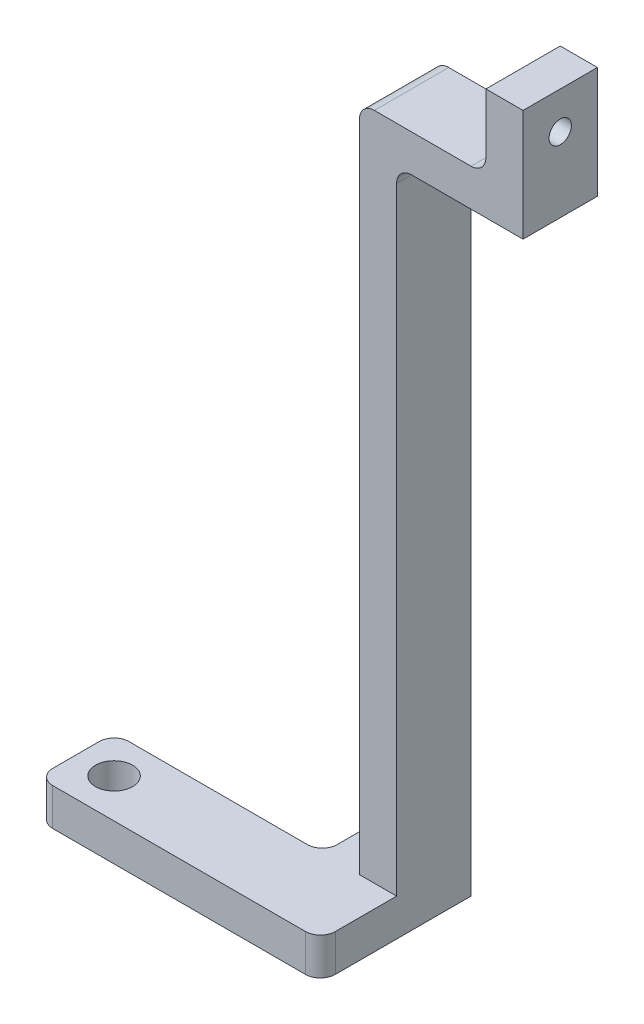
ISO-10303-21;
HEADER;
FILE_DESCRIPTION(('STEP AP214'),'2;1');
FILE_NAME('part.step','',(''),(''),'','','');
FILE_SCHEMA(('AUTOMOTIVE_DESIGN { 1 0 10303 214 1 1 1 1 }'));
ENDSEC;
DATA;
#1=APPLICATION_CONTEXT('core data for automotive mechanical design processes');
#2=APPLICATION_PROTOCOL_DEFINITION('international standard','automotive_design',2000,#1);
#3=PRODUCT_CONTEXT('',#1,'mechanical');
#4=PRODUCT('Part','Part','',(#3));
#5=PRODUCT_RELATED_PRODUCT_CATEGORY('part','',(#4));
#6=PRODUCT_DEFINITION_FORMATION('','',#4);
#7=PRODUCT_DEFINITION_CONTEXT('part definition',#1,'design');
#8=PRODUCT_DEFINITION('design','',#6,#7);
#9=PRODUCT_DEFINITION_SHAPE('','',#8);
#10=(LENGTH_UNIT() NAMED_UNIT(*) SI_UNIT(.MILLI.,.METRE.));
#11=(NAMED_UNIT(*) PLANE_ANGLE_UNIT() SI_UNIT($,.RADIAN.));
#12=(NAMED_UNIT(*) SI_UNIT($,.STERADIAN.) SOLID_ANGLE_UNIT());
#13=UNCERTAINTY_MEASURE_WITH_UNIT(LENGTH_MEASURE(1.E-05),#10,'distance_accuracy_value','');
#14=(GEOMETRIC_REPRESENTATION_CONTEXT(3) GLOBAL_UNCERTAINTY_ASSIGNED_CONTEXT((#13)) GLOBAL_UNIT_ASSIGNED_CONTEXT((#10,
#11,#12)) REPRESENTATION_CONTEXT('',''));
#15=CARTESIAN_POINT('',(0.,0.,0.));
#16=DIRECTION('',(0.,0.,1.));
#17=DIRECTION('',(1.,0.,0.));
#18=AXIS2_PLACEMENT_3D('',#15,#16,#17);
#19=CARTESIAN_POINT('',(0.,102.,0.));
#20=DIRECTION('',(0.,-1.,0.));
#21=DIRECTION('',(0.,0.,-1.));
#22=AXIS2_PLACEMENT_3D('',#19,#20,#21);
#23=PLANE('',#22);
#24=DIRECTION('',(1.,0.,0.));
#25=VECTOR('',#24,1.);
#26=CARTESIAN_POINT('',(17.,102.,-4.99999999999999));
#27=LINE('',#26,#25);
#28=CARTESIAN_POINT('',(-20.,102.,-4.99999999999999));
#29=VERTEX_POINT('',#28);
#30=CARTESIAN_POINT('',(-7.,102.,-4.99999999999999));
#31=VERTEX_POINT('',#30);
#32=EDGE_CURVE('E256',#29,#31,#27,.T.);
#33=ORIENTED_EDGE('',*,*,#32,.T.);
#34=DIRECTION('',(0.,0.,1.));
#35=VECTOR('',#34,1.);
#36=CARTESIAN_POINT('',(-7.,102.,-15.));
#37=LINE('',#36,#35);
#38=CARTESIAN_POINT('',(-7.,102.,-15.));
#39=VERTEX_POINT('',#38);
#40=EDGE_CURVE('E354',#31,#39,#37,.F.);
#41=ORIENTED_EDGE('',*,*,#40,.T.);
#42=DIRECTION('',(-1.,0.,0.));
#43=VECTOR('',#42,1.);
#44=CARTESIAN_POINT('',(17.,102.,-15.));
#45=LINE('',#44,#43);
#46=CARTESIAN_POINT('',(-20.,102.,-15.));
#47=VERTEX_POINT('',#46);
#48=EDGE_CURVE('E263',#39,#47,#45,.T.);
#49=ORIENTED_EDGE('',*,*,#48,.T.);
#50=DIRECTION('',(0.,0.,1.));
#51=VECTOR('',#50,1.);
#52=CARTESIAN_POINT('',(-20.,102.,0.));
#53=LINE('',#52,#51);
#54=EDGE_CURVE('E253',#47,#29,#53,.T.);
#55=ORIENTED_EDGE('',*,*,#54,.T.);
#56=EDGE_LOOP('',(#33,#41,#49,#55));
#57=FACE_BOUND('',#56,.T.);
#58=ADVANCED_FACE('F43',(#57),#23,.F.);
#59=CARTESIAN_POINT('',(-22.,102.,-15.));
#60=DIRECTION('',(1.,0.,0.));
#61=DIRECTION('',(0.,0.,-1.));
#62=AXIS2_PLACEMENT_3D('',#59,#60,#61);
#63=PLANE('',#62);
#64=DIRECTION('',(0.,0.,-1.));
#65=VECTOR('',#64,1.);
#66=CARTESIAN_POINT('',(-22.,12.,-5.));
#67=LINE('',#66,#65);
#68=CARTESIAN_POINT('',(-22.,12.,-5.));
#69=VERTEX_POINT('',#68);
#70=CARTESIAN_POINT('',(-22.,12.,-15.));
#71=VERTEX_POINT('',#70);
#72=EDGE_CURVE('E223',#69,#71,#67,.T.);
#73=ORIENTED_EDGE('',*,*,#72,.F.);
#74=DIRECTION('',(0.,-1.,0.));
#75=VECTOR('',#74,1.);
#76=CARTESIAN_POINT('',(-22.,102.,-5.));
#77=LINE('',#76,#75);
#78=CARTESIAN_POINT('',(-22.,100.,-5.));
#79=VERTEX_POINT('',#78);
#80=EDGE_CURVE('E239',#79,#69,#77,.T.);
#81=ORIENTED_EDGE('',*,*,#80,.F.);
#82=DIRECTION('',(0.,0.,1.));
#83=VECTOR('',#82,1.);
#84=CARTESIAN_POINT('',(-22.,100.,-15.));
#85=LINE('',#84,#83);
#86=CARTESIAN_POINT('',(-22.,100.,-15.));
#87=VERTEX_POINT('',#86);
#88=EDGE_CURVE('E250',#79,#87,#85,.F.);
#89=ORIENTED_EDGE('',*,*,#88,.T.);
#90=DIRECTION('',(0.,-1.,0.));
#91=VECTOR('',#90,1.);
#92=CARTESIAN_POINT('',(-22.,102.,-15.));
#93=LINE('',#92,#91);
#94=EDGE_CURVE('E252',#87,#71,#93,.T.);
#95=ORIENTED_EDGE('',*,*,#94,.T.);
#96=EDGE_LOOP('',(#73,#81,#89,#95));
#97=FACE_BOUND('',#96,.T.);
#98=ADVANCED_FACE('F430',(#97),#63,.F.);
#99=CARTESIAN_POINT('',(-17.,102.,-15.));
#100=DIRECTION('',(-1.,0.,0.));
#101=DIRECTION('',(0.,0.,1.));
#102=AXIS2_PLACEMENT_3D('',#99,#100,#101);
#103=PLANE('',#102);
#104=DIRECTION('',(0.,-1.,0.));
#105=VECTOR('',#104,1.);
#106=CARTESIAN_POINT('',(-17.,102.,-15.));
#107=LINE('',#106,#105);
#108=CARTESIAN_POINT('',(-17.,95.,-15.));
#109=VERTEX_POINT('',#108);
#110=CARTESIAN_POINT('',(-17.,7.00000000000001,-15.));
#111=VERTEX_POINT('',#110);
#112=EDGE_CURVE('E242',#109,#111,#107,.T.);
#113=ORIENTED_EDGE('',*,*,#112,.F.);
#114=DIRECTION('',(0.,0.,-1.));
#115=VECTOR('',#114,1.);
#116=CARTESIAN_POINT('',(-17.,95.,-5.));
#117=LINE('',#116,#115);
#118=CARTESIAN_POINT('',(-17.,95.,-5.));
#119=VERTEX_POINT('',#118);
#120=EDGE_CURVE('E234',#109,#119,#117,.F.);
#121=ORIENTED_EDGE('',*,*,#120,.T.);
#122=DIRECTION('',(0.,-1.,0.));
#123=VECTOR('',#122,1.);
#124=CARTESIAN_POINT('',(-17.,102.,-5.));
#125=LINE('',#124,#123);
#126=CARTESIAN_POINT('',(-17.,12.,-5.));
#127=VERTEX_POINT('',#126);
#128=EDGE_CURVE('E244',#119,#127,#125,.T.);
#129=ORIENTED_EDGE('',*,*,#128,.T.);
#130=DIRECTION('',(0.,0.,-1.));
#131=VECTOR('',#130,1.);
#132=CARTESIAN_POINT('',(-17.,12.,-5.));
#133=LINE('',#132,#131);
#134=CARTESIAN_POINT('',(-17.,12.,3.25062536576994));
#135=VERTEX_POINT('',#134);
#136=EDGE_CURVE('E318',#135,#127,#133,.T.);
#137=ORIENTED_EDGE('',*,*,#136,.F.);
#138=DIRECTION('',(0.,-1.,0.));
#139=VECTOR('',#138,1.);
#140=CARTESIAN_POINT('',(-17.,12.,3.25062536576994));
#141=LINE('',#140,#139);
#142=CARTESIAN_POINT('',(-17.,7.,3.25062536576994));
#143=VERTEX_POINT('',#142);
#144=EDGE_CURVE('E274',#135,#143,#141,.T.);
#145=ORIENTED_EDGE('',*,*,#144,.T.);
#146=DIRECTION('',(0.,0.,-1.));
#147=VECTOR('',#146,1.);
#148=CARTESIAN_POINT('',(-17.,7.,-15.));
#149=LINE('',#148,#147);
#150=EDGE_CURVE('E195',#143,#111,#149,.T.);
#151=ORIENTED_EDGE('',*,*,#150,.T.);
#152=EDGE_LOOP('',(#113,#121,#129,#137,#145,#151));
#153=FACE_BOUND('',#152,.T.);
#154=ADVANCED_FACE('F405',(#153),#103,.F.);
#155=CARTESIAN_POINT('',(17.,102.,-15.));
#156=DIRECTION('',(0.,0.,1.));
#157=DIRECTION('',(1.,0.,0.));
#158=AXIS2_PLACEMENT_3D('',#155,#156,#157);
#159=PLANE('',#158);
#160=DIRECTION('',(-1.,0.,0.));
#161=VECTOR('',#160,1.);
#162=CARTESIAN_POINT('',(-22.,7.,-15.));
#163=LINE('',#162,#161);
#164=CARTESIAN_POINT('',(-25.,7.,-15.));
#165=VERTEX_POINT('',#164);
#166=EDGE_CURVE('E260',#111,#165,#163,.T.);
#167=ORIENTED_EDGE('',*,*,#166,.T.);
#168=DIRECTION('',(0.,-1.,0.));
#169=VECTOR('',#168,1.);
#170=CARTESIAN_POINT('',(-25.,12.,-15.));
#171=LINE('',#170,#169);
#172=CARTESIAN_POINT('',(-25.,12.,-15.));
#173=VERTEX_POINT('',#172);
#174=EDGE_CURVE('E346',#165,#173,#171,.F.);
#175=ORIENTED_EDGE('',*,*,#174,.T.);
#176=DIRECTION('',(1.,0.,0.));
#177=VECTOR('',#176,1.);
#178=CARTESIAN_POINT('',(-27.,12.,-15.));
#179=LINE('',#178,#177);
#180=EDGE_CURVE('E230',#173,#71,#179,.T.);
#181=ORIENTED_EDGE('',*,*,#180,.T.);
#182=ORIENTED_EDGE('',*,*,#94,.F.);
#183=CARTESIAN_POINT('',(-20.,100.,-15.));
#184=DIRECTION('',(0.,0.,1.));
#185=DIRECTION('',(1.,0.,0.));
#186=AXIS2_PLACEMENT_3D('',#183,#184,#185);
#187=CIRCLE('',#186,2.);
#188=EDGE_CURVE('E257',#87,#47,#187,.F.);
#189=ORIENTED_EDGE('',*,*,#188,.T.);
#190=ORIENTED_EDGE('',*,*,#48,.F.);
#191=CARTESIAN_POINT('',(-7.,104.,-15.));
#192=DIRECTION('',(0.,0.,1.));
#193=DIRECTION('',(1.,0.,0.));
#194=AXIS2_PLACEMENT_3D('',#191,#192,#193);
#195=CIRCLE('',#194,2.);
#196=CARTESIAN_POINT('',(-5.,104.,-15.));
#197=VERTEX_POINT('',#196);
#198=EDGE_CURVE('E12',#39,#197,#195,.T.);
#199=ORIENTED_EDGE('',*,*,#198,.T.);
#200=DIRECTION('',(0.,-1.,0.));
#201=VECTOR('',#200,1.);
#202=CARTESIAN_POINT('',(-5.,112.,-15.));
#203=LINE('',#202,#201);
#204=CARTESIAN_POINT('',(-5.,112.,-15.));
#205=VERTEX_POINT('',#204);
#206=EDGE_CURVE('E202',#205,#197,#203,.T.);
#207=ORIENTED_EDGE('',*,*,#206,.F.);
#208=DIRECTION('',(-1.,0.,0.));
#209=VECTOR('',#208,1.);
#210=CARTESIAN_POINT('',(0.,112.,-15.));
#211=LINE('',#210,#209);
#212=CARTESIAN_POINT('',(0.,112.,-15.));
#213=VERTEX_POINT('',#212);
#214=EDGE_CURVE('E198',#213,#205,#211,.T.);
#215=ORIENTED_EDGE('',*,*,#214,.F.);
#216=DIRECTION('',(0.,-1.,0.));
#217=VECTOR('',#216,1.);
#218=CARTESIAN_POINT('',(0.,102.,-15.));
#219=LINE('',#218,#217);
#220=CARTESIAN_POINT('',(0.,97.,-15.));
#221=VERTEX_POINT('',#220);
#222=EDGE_CURVE('E185',#213,#221,#219,.T.);
#223=ORIENTED_EDGE('',*,*,#222,.T.);
#224=DIRECTION('',(-1.,0.,0.));
#225=VECTOR('',#224,1.);
#226=CARTESIAN_POINT('',(28.1803398874989,97.,-15.));
#227=LINE('',#226,#225);
#228=CARTESIAN_POINT('',(-15.,97.,-15.));
#229=VERTEX_POINT('',#228);
#230=EDGE_CURVE('E194',#221,#229,#227,.T.);
#231=ORIENTED_EDGE('',*,*,#230,.T.);
#232=CARTESIAN_POINT('',(-15.,95.,-15.));
#233=DIRECTION('',(0.,0.,1.));
#234=DIRECTION('',(1.,0.,0.));
#235=AXIS2_PLACEMENT_3D('',#232,#233,#234);
#236=CIRCLE('',#235,2.);
#237=EDGE_CURVE('E240',#229,#109,#236,.T.);
#238=ORIENTED_EDGE('',*,*,#237,.T.);
#239=ORIENTED_EDGE('',*,*,#112,.T.);
#240=EDGE_LOOP('',(#167,#175,#181,#182,#189,#190,#199,#207,#215,#223,#231,#238,#239));
#241=FACE_BOUND('',#240,.T.);
#242=ADVANCED_FACE('F200',(#241),#159,.F.);
#243=CARTESIAN_POINT('',(17.,102.,-4.99999999999999));
#244=DIRECTION('',(0.,0.,-1.));
#245=DIRECTION('',(-1.,0.,0.));
#246=AXIS2_PLACEMENT_3D('',#243,#244,#245);
#247=PLANE('',#246);
#248=ORIENTED_EDGE('',*,*,#80,.T.);
#249=DIRECTION('',(-1.,0.,0.));
#250=VECTOR('',#249,1.);
#251=CARTESIAN_POINT('',(-17.,12.,-5.));
#252=LINE('',#251,#250);
#253=EDGE_CURVE('E330',#127,#69,#252,.T.);
#254=ORIENTED_EDGE('',*,*,#253,.F.);
#255=ORIENTED_EDGE('',*,*,#128,.F.);
#256=CARTESIAN_POINT('',(-15.,95.,-4.99999999999999));
#257=DIRECTION('',(0.,0.,-1.));
#258=DIRECTION('',(-1.,0.,0.));
#259=AXIS2_PLACEMENT_3D('',#256,#257,#258);
#260=CIRCLE('',#259,2.);
#261=CARTESIAN_POINT('',(-15.,97.,-5.));
#262=VERTEX_POINT('',#261);
#263=EDGE_CURVE('E235',#119,#262,#260,.T.);
#264=ORIENTED_EDGE('',*,*,#263,.T.);
#265=DIRECTION('',(-1.,0.,0.));
#266=VECTOR('',#265,1.);
#267=CARTESIAN_POINT('',(28.1803398874989,97.,-5.));
#268=LINE('',#267,#266);
#269=CARTESIAN_POINT('',(0.,97.,-5.));
#270=VERTEX_POINT('',#269);
#271=EDGE_CURVE('E249',#270,#262,#268,.T.);
#272=ORIENTED_EDGE('',*,*,#271,.F.);
#273=DIRECTION('',(0.,1.,0.));
#274=VECTOR('',#273,1.);
#275=CARTESIAN_POINT('',(0.,102.,-4.99999999999999));
#276=LINE('',#275,#274);
#277=CARTESIAN_POINT('',(0.,112.,-4.99999999999999));
#278=VERTEX_POINT('',#277);
#279=EDGE_CURVE('E238',#270,#278,#276,.T.);
#280=ORIENTED_EDGE('',*,*,#279,.T.);
#281=DIRECTION('',(1.,0.,0.));
#282=VECTOR('',#281,1.);
#283=CARTESIAN_POINT('',(0.,112.,-4.99999999999999));
#284=LINE('',#283,#282);
#285=CARTESIAN_POINT('',(-5.,112.,-4.99999999999999));
#286=VERTEX_POINT('',#285);
#287=EDGE_CURVE('E210',#286,#278,#284,.T.);
#288=ORIENTED_EDGE('',*,*,#287,.F.);
#289=DIRECTION('',(0.,-1.,0.));
#290=VECTOR('',#289,1.);
#291=CARTESIAN_POINT('',(-5.,112.,-4.99999999999999));
#292=LINE('',#291,#290);
#293=CARTESIAN_POINT('',(-5.,104.,-4.99999999999999));
#294=VERTEX_POINT('',#293);
#295=EDGE_CURVE('E220',#286,#294,#292,.T.);
#296=ORIENTED_EDGE('',*,*,#295,.T.);
#297=CARTESIAN_POINT('',(-7.,104.,-4.99999999999999));
#298=DIRECTION('',(0.,0.,-1.));
#299=DIRECTION('',(-1.,0.,0.));
#300=AXIS2_PLACEMENT_3D('',#297,#298,#299);
#301=CIRCLE('',#300,2.);
#302=EDGE_CURVE('E51',#294,#31,#301,.T.);
#303=ORIENTED_EDGE('',*,*,#302,.T.);
#304=ORIENTED_EDGE('',*,*,#32,.F.);
#305=CARTESIAN_POINT('',(-20.,100.,-4.99999999999999));
#306=DIRECTION('',(0.,0.,-1.));
#307=DIRECTION('',(-1.,0.,0.));
#308=AXIS2_PLACEMENT_3D('',#305,#306,#307);
#309=CIRCLE('',#308,2.);
#310=EDGE_CURVE('E254',#29,#79,#309,.F.);
#311=ORIENTED_EDGE('',*,*,#310,.T.);
#312=EDGE_LOOP('',(#248,#254,#255,#264,#272,#280,#288,#296,#303,#304,#311));
#313=FACE_BOUND('',#312,.T.);
#314=ADVANCED_FACE('F409',(#313),#247,.F.);
#315=CARTESIAN_POINT('',(28.1803398874989,97.,-5.));
#316=DIRECTION('',(0.,1.,0.));
#317=DIRECTION('',(0.,0.,1.));
#318=AXIS2_PLACEMENT_3D('',#315,#316,#317);
#319=PLANE('',#318);
#320=ORIENTED_EDGE('',*,*,#230,.F.);
#321=DIRECTION('',(0.,0.,1.));
#322=VECTOR('',#321,1.);
#323=CARTESIAN_POINT('',(0.,97.,-5.));
#324=LINE('',#323,#322);
#325=EDGE_CURVE('E191',#221,#270,#324,.T.);
#326=ORIENTED_EDGE('',*,*,#325,.T.);
#327=ORIENTED_EDGE('',*,*,#271,.T.);
#328=DIRECTION('',(0.,0.,-1.));
#329=VECTOR('',#328,1.);
#330=CARTESIAN_POINT('',(-15.,97.,-15.));
#331=LINE('',#330,#329);
#332=EDGE_CURVE('E245',#262,#229,#331,.T.);
#333=ORIENTED_EDGE('',*,*,#332,.T.);
#334=EDGE_LOOP('',(#320,#326,#327,#333));
#335=FACE_BOUND('',#334,.T.);
#336=ADVANCED_FACE('F416',(#335),#319,.F.);
#337=CARTESIAN_POINT('',(-20.,100.,0.));
#338=DIRECTION('',(0.,0.,1.));
#339=DIRECTION('',(1.,0.,0.));
#340=AXIS2_PLACEMENT_3D('',#337,#338,#339);
#341=CYLINDRICAL_SURFACE('',#340,2.);
#342=ORIENTED_EDGE('',*,*,#188,.F.);
#343=ORIENTED_EDGE('',*,*,#88,.F.);
#344=ORIENTED_EDGE('',*,*,#310,.F.);
#345=ORIENTED_EDGE('',*,*,#54,.F.);
#346=EDGE_LOOP('',(#342,#343,#344,#345));
#347=FACE_BOUND('',#346,.T.);
#348=ADVANCED_FACE('F431',(#347),#341,.T.);
#349=CARTESIAN_POINT('',(-15.,95.,-5.));
#350=DIRECTION('',(0.,0.,1.));
#351=DIRECTION('',(1.,0.,0.));
#352=AXIS2_PLACEMENT_3D('',#349,#350,#351);
#353=CYLINDRICAL_SURFACE('',#352,2.);
#354=ORIENTED_EDGE('',*,*,#263,.F.);
#355=ORIENTED_EDGE('',*,*,#120,.F.);
#356=ORIENTED_EDGE('',*,*,#237,.F.);
#357=ORIENTED_EDGE('',*,*,#332,.F.);
#358=EDGE_LOOP('',(#354,#355,#356,#357));
#359=FACE_BOUND('',#358,.T.);
#360=ADVANCED_FACE('F413',(#359),#353,.F.);
#361=CARTESIAN_POINT('',(-50.,-3.,-5.2372220082647E-13));
#362=DIRECTION('',(0.,1.,0.));
#363=DIRECTION('',(0.,0.,1.));
#364=AXIS2_PLACEMENT_3D('',#361,#362,#363);
#365=CYLINDRICAL_SURFACE('',#364,2.5);
#366=CARTESIAN_POINT('',(-50.,7.,-5.2372220082647E-13));
#367=DIRECTION('',(0.,1.,0.));
#368=DIRECTION('',(0.,0.,1.));
#369=AXIS2_PLACEMENT_3D('',#366,#367,#368);
#370=CIRCLE('',#369,2.5);
#371=CARTESIAN_POINT('',(-50.,7.,2.49999999999948));
#372=VERTEX_POINT('',#371);
#373=EDGE_CURVE('E248',#372,#372,#370,.F.);
#374=ORIENTED_EDGE('',*,*,#373,.T.);
#375=EDGE_LOOP('',(#374));
#376=FACE_BOUND('',#375,.T.);
#377=CARTESIAN_POINT('',(-50.,12.,-5.2372220082647E-13));
#378=DIRECTION('',(0.,1.,0.));
#379=DIRECTION('',(0.,0.,1.));
#380=AXIS2_PLACEMENT_3D('',#377,#378,#379);
#381=CIRCLE('',#380,2.5);
#382=CARTESIAN_POINT('',(-50.,12.,2.49999999999948));
#383=VERTEX_POINT('',#382);
#384=EDGE_CURVE('E319',#383,#383,#381,.T.);
#385=ORIENTED_EDGE('',*,*,#384,.T.);
#386=EDGE_LOOP('',(#385));
#387=FACE_BOUND('',#386,.T.);
#388=ADVANCED_FACE('F438',(#376,#387),#365,.F.);
#389=CARTESIAN_POINT('',(0.,0.,0.));
#390=DIRECTION('',(-1.,0.,0.));
#391=DIRECTION('',(0.,0.,1.));
#392=AXIS2_PLACEMENT_3D('',#389,#390,#391);
#393=PLANE('',#392);
#394=CARTESIAN_POINT('',(0.,107.,-9.99999999999999));
#395=DIRECTION('',(-1.,0.,0.));
#396=DIRECTION('',(0.,0.,1.));
#397=AXIS2_PLACEMENT_3D('',#394,#395,#396);
#398=CIRCLE('',#397,1.5);
#399=CARTESIAN_POINT('',(0.,107.,-8.49999999999999));
#400=VERTEX_POINT('',#399);
#401=EDGE_CURVE('E211',#400,#400,#398,.F.);
#402=ORIENTED_EDGE('',*,*,#401,.F.);
#403=EDGE_LOOP('',(#402));
#404=FACE_BOUND('',#403,.T.);
#405=ORIENTED_EDGE('',*,*,#279,.F.);
#406=ORIENTED_EDGE('',*,*,#325,.F.);
#407=ORIENTED_EDGE('',*,*,#222,.F.);
#408=DIRECTION('',(0.,0.,-1.));
#409=VECTOR('',#408,1.);
#410=CARTESIAN_POINT('',(0.,112.,-4.99999999999999));
#411=LINE('',#410,#409);
#412=EDGE_CURVE('E189',#278,#213,#411,.T.);
#413=ORIENTED_EDGE('',*,*,#412,.F.);
#414=EDGE_LOOP('',(#405,#406,#407,#413));
#415=FACE_BOUND('',#414,.T.);
#416=ADVANCED_FACE('F187',(#404,#415),#393,.F.);
#417=CARTESIAN_POINT('',(-17.,12.,-5.));
#418=DIRECTION('',(0.,0.,1.));
#419=DIRECTION('',(1.,0.,0.));
#420=AXIS2_PLACEMENT_3D('',#417,#418,#419);
#421=PLANE('',#420);
#422=CARTESIAN_POINT('',(-29.,12.,-5.));
#423=VERTEX_POINT('',#422);
#424=CARTESIAN_POINT('',(-53.,12.,-5.));
#425=VERTEX_POINT('',#424);
#426=EDGE_CURVE('E329',#423,#425,#252,.T.);
#427=ORIENTED_EDGE('',*,*,#426,.F.);
#428=DIRECTION('',(0.,1.,0.));
#429=VECTOR('',#428,1.);
#430=CARTESIAN_POINT('',(-29.,12.,-5.));
#431=LINE('',#430,#429);
#432=CARTESIAN_POINT('',(-29.,7.,-5.));
#433=VERTEX_POINT('',#432);
#434=EDGE_CURVE('E350',#423,#433,#431,.F.);
#435=ORIENTED_EDGE('',*,*,#434,.T.);
#436=DIRECTION('',(-1.,0.,0.));
#437=VECTOR('',#436,1.);
#438=CARTESIAN_POINT('',(-17.,7.,-5.));
#439=LINE('',#438,#437);
#440=CARTESIAN_POINT('',(-53.,7.,-5.));
#441=VERTEX_POINT('',#440);
#442=EDGE_CURVE('E316',#433,#441,#439,.T.);
#443=ORIENTED_EDGE('',*,*,#442,.T.);
#444=DIRECTION('',(0.,-1.,0.));
#445=VECTOR('',#444,1.);
#446=CARTESIAN_POINT('',(-53.,12.,-5.));
#447=LINE('',#446,#445);
#448=EDGE_CURVE('E282',#425,#441,#447,.T.);
#449=ORIENTED_EDGE('',*,*,#448,.F.);
#450=EDGE_LOOP('',(#427,#435,#443,#449));
#451=FACE_BOUND('',#450,.T.);
#452=ADVANCED_FACE('F381',(#451),#421,.F.);
#453=CARTESIAN_POINT('',(-19.,12.,3.25062536576995));
#454=DIRECTION('',(0.,1.,0.));
#455=DIRECTION('',(0.,0.,1.));
#456=AXIS2_PLACEMENT_3D('',#453,#454,#455);
#457=PLANE('',#456);
#458=ORIENTED_EDGE('',*,*,#180,.F.);
#459=CARTESIAN_POINT('',(-25.,12.,-13.));
#460=DIRECTION('',(0.,1.,0.));
#461=DIRECTION('',(0.,0.,1.));
#462=AXIS2_PLACEMENT_3D('',#459,#460,#461);
#463=CIRCLE('',#462,2.);
#464=CARTESIAN_POINT('',(-27.,12.,-13.));
#465=VERTEX_POINT('',#464);
#466=EDGE_CURVE('E348',#173,#465,#463,.T.);
#467=ORIENTED_EDGE('',*,*,#466,.T.);
#468=DIRECTION('',(0.,0.,-1.));
#469=VECTOR('',#468,1.);
#470=CARTESIAN_POINT('',(-27.,12.,-5.));
#471=LINE('',#470,#469);
#472=CARTESIAN_POINT('',(-27.,12.,-7.));
#473=VERTEX_POINT('',#472);
#474=EDGE_CURVE('E224',#473,#465,#471,.T.);
#475=ORIENTED_EDGE('',*,*,#474,.F.);
#476=CARTESIAN_POINT('',(-29.,12.,-7.));
#477=DIRECTION('',(0.,1.,0.));
#478=DIRECTION('',(0.,0.,1.));
#479=AXIS2_PLACEMENT_3D('',#476,#477,#478);
#480=CIRCLE('',#479,2.);
#481=EDGE_CURVE('E356',#473,#423,#480,.F.);
#482=ORIENTED_EDGE('',*,*,#481,.T.);
#483=ORIENTED_EDGE('',*,*,#426,.T.);
#484=CARTESIAN_POINT('',(-53.,12.,-3.));
#485=DIRECTION('',(0.,1.,0.));
#486=DIRECTION('',(0.,0.,-1.));
#487=AXIS2_PLACEMENT_3D('',#484,#485,#486);
#488=CIRCLE('',#487,2.);
#489=CARTESIAN_POINT('',(-55.,12.,-3.));
#490=VERTEX_POINT('',#489);
#491=EDGE_CURVE('E327',#425,#490,#488,.T.);
#492=ORIENTED_EDGE('',*,*,#491,.T.);
#493=DIRECTION('',(0.,0.,1.));
#494=VECTOR('',#493,1.);
#495=CARTESIAN_POINT('',(-55.,12.,-3.));
#496=LINE('',#495,#494);
#497=CARTESIAN_POINT('',(-55.,12.,3.25062536576996));
#498=VERTEX_POINT('',#497);
#499=EDGE_CURVE('E325',#490,#498,#496,.T.);
#500=ORIENTED_EDGE('',*,*,#499,.T.);
#501=CARTESIAN_POINT('',(-53.,12.,3.25062536576996));
#502=DIRECTION('',(0.,1.,0.));
#503=DIRECTION('',(0.,0.,-1.));
#504=AXIS2_PLACEMENT_3D('',#501,#502,#503);
#505=CIRCLE('',#504,2.);
#506=CARTESIAN_POINT('',(-53.,12.,5.25062536576996));
#507=VERTEX_POINT('',#506);
#508=EDGE_CURVE('E323',#498,#507,#505,.T.);
#509=ORIENTED_EDGE('',*,*,#508,.T.);
#510=DIRECTION('',(1.,0.,0.));
#511=VECTOR('',#510,1.);
#512=CARTESIAN_POINT('',(-19.,12.,5.25062536576995));
#513=LINE('',#512,#511);
#514=CARTESIAN_POINT('',(-19.,12.,5.25062536576995));
#515=VERTEX_POINT('',#514);
#516=EDGE_CURVE('E321',#507,#515,#513,.T.);
#517=ORIENTED_EDGE('',*,*,#516,.T.);
#518=CARTESIAN_POINT('',(-19.,12.,3.25062536576995));
#519=DIRECTION('',(0.,1.,0.));
#520=DIRECTION('',(0.,0.,1.));
#521=AXIS2_PLACEMENT_3D('',#518,#519,#520);
#522=CIRCLE('',#521,2.);
#523=EDGE_CURVE('E315',#515,#135,#522,.T.);
#524=ORIENTED_EDGE('',*,*,#523,.T.);
#525=ORIENTED_EDGE('',*,*,#136,.T.);
#526=ORIENTED_EDGE('',*,*,#253,.T.);
#527=ORIENTED_EDGE('',*,*,#72,.T.);
#528=EDGE_LOOP('',(#458,#467,#475,#482,#483,#492,#500,#509,#517,#524,#525,#526,#527));
#529=FACE_BOUND('',#528,.T.);
#530=ORIENTED_EDGE('',*,*,#384,.F.);
#531=EDGE_LOOP('',(#530));
#532=FACE_BOUND('',#531,.T.);
#533=ADVANCED_FACE('F377',(#529,#532),#457,.T.);
#534=CARTESIAN_POINT('',(-53.,12.,-3.));
#535=DIRECTION('',(0.,-1.,0.));
#536=DIRECTION('',(0.,0.,-1.));
#537=AXIS2_PLACEMENT_3D('',#534,#535,#536);
#538=CYLINDRICAL_SURFACE('',#537,2.);
#539=CARTESIAN_POINT('',(-53.,7.,-3.));
#540=DIRECTION('',(0.,1.,0.));
#541=DIRECTION('',(0.,0.,-1.));
#542=AXIS2_PLACEMENT_3D('',#539,#540,#541);
#543=CIRCLE('',#542,2.);
#544=CARTESIAN_POINT('',(-55.,7.,-3.));
#545=VERTEX_POINT('',#544);
#546=EDGE_CURVE('E286',#441,#545,#543,.T.);
#547=ORIENTED_EDGE('',*,*,#546,.T.);
#548=DIRECTION('',(0.,-1.,0.));
#549=VECTOR('',#548,1.);
#550=CARTESIAN_POINT('',(-55.,12.,-3.));
#551=LINE('',#550,#549);
#552=EDGE_CURVE('E287',#490,#545,#551,.T.);
#553=ORIENTED_EDGE('',*,*,#552,.F.);
#554=ORIENTED_EDGE('',*,*,#491,.F.);
#555=ORIENTED_EDGE('',*,*,#448,.T.);
#556=EDGE_LOOP('',(#547,#553,#554,#555));
#557=FACE_BOUND('',#556,.T.);
#558=ADVANCED_FACE('F385',(#557),#538,.T.);
#559=CARTESIAN_POINT('',(-55.,12.,-3.));
#560=DIRECTION('',(1.,0.,0.));
#561=DIRECTION('',(0.,0.,-1.));
#562=AXIS2_PLACEMENT_3D('',#559,#560,#561);
#563=PLANE('',#562);
#564=DIRECTION('',(0.,0.,1.));
#565=VECTOR('',#564,1.);
#566=CARTESIAN_POINT('',(-55.,7.,-3.));
#567=LINE('',#566,#565);
#568=CARTESIAN_POINT('',(-55.,7.,3.25062536576996));
#569=VERTEX_POINT('',#568);
#570=EDGE_CURVE('E285',#545,#569,#567,.T.);
#571=ORIENTED_EDGE('',*,*,#570,.T.);
#572=DIRECTION('',(0.,-1.,0.));
#573=VECTOR('',#572,1.);
#574=CARTESIAN_POINT('',(-55.,12.,3.25062536576996));
#575=LINE('',#574,#573);
#576=EDGE_CURVE('E291',#498,#569,#575,.T.);
#577=ORIENTED_EDGE('',*,*,#576,.F.);
#578=ORIENTED_EDGE('',*,*,#499,.F.);
#579=ORIENTED_EDGE('',*,*,#552,.T.);
#580=EDGE_LOOP('',(#571,#577,#578,#579));
#581=FACE_BOUND('',#580,.T.);
#582=ADVANCED_FACE('F391',(#581),#563,.F.);
#583=CARTESIAN_POINT('',(-53.,12.,3.25062536576996));
#584=DIRECTION('',(0.,-1.,0.));
#585=DIRECTION('',(0.,0.,-1.));
#586=AXIS2_PLACEMENT_3D('',#583,#584,#585);
#587=CYLINDRICAL_SURFACE('',#586,2.);
#588=CARTESIAN_POINT('',(-53.,7.,3.25062536576996));
#589=DIRECTION('',(0.,1.,0.));
#590=DIRECTION('',(0.,0.,-1.));
#591=AXIS2_PLACEMENT_3D('',#588,#589,#590);
#592=CIRCLE('',#591,2.);
#593=CARTESIAN_POINT('',(-53.,7.,5.25062536576996));
#594=VERTEX_POINT('',#593);
#595=EDGE_CURVE('E290',#569,#594,#592,.T.);
#596=ORIENTED_EDGE('',*,*,#595,.T.);
#597=DIRECTION('',(0.,-1.,0.));
#598=VECTOR('',#597,1.);
#599=CARTESIAN_POINT('',(-53.,12.,5.25062536576996));
#600=LINE('',#599,#598);
#601=EDGE_CURVE('E295',#507,#594,#600,.T.);
#602=ORIENTED_EDGE('',*,*,#601,.F.);
#603=ORIENTED_EDGE('',*,*,#508,.F.);
#604=ORIENTED_EDGE('',*,*,#576,.T.);
#605=EDGE_LOOP('',(#596,#602,#603,#604));
#606=FACE_BOUND('',#605,.T.);
#607=ADVANCED_FACE('F393',(#606),#587,.T.);
#608=CARTESIAN_POINT('',(-19.,12.,5.25062536576995));
#609=DIRECTION('',(0.,0.,-1.));
#610=DIRECTION('',(-1.,0.,0.));
#611=AXIS2_PLACEMENT_3D('',#608,#609,#610);
#612=PLANE('',#611);
#613=DIRECTION('',(1.,0.,0.));
#614=VECTOR('',#613,1.);
#615=CARTESIAN_POINT('',(-19.,7.,5.25062536576995));
#616=LINE('',#615,#614);
#617=CARTESIAN_POINT('',(-19.,7.,5.25062536576995));
#618=VERTEX_POINT('',#617);
#619=EDGE_CURVE('E294',#594,#618,#616,.T.);
#620=ORIENTED_EDGE('',*,*,#619,.T.);
#621=DIRECTION('',(0.,-1.,0.));
#622=VECTOR('',#621,1.);
#623=CARTESIAN_POINT('',(-19.,12.,5.25062536576995));
#624=LINE('',#623,#622);
#625=EDGE_CURVE('E299',#515,#618,#624,.T.);
#626=ORIENTED_EDGE('',*,*,#625,.F.);
#627=ORIENTED_EDGE('',*,*,#516,.F.);
#628=ORIENTED_EDGE('',*,*,#601,.T.);
#629=EDGE_LOOP('',(#620,#626,#627,#628));
#630=FACE_BOUND('',#629,.T.);
#631=ADVANCED_FACE('F397',(#630),#612,.F.);
#632=CARTESIAN_POINT('',(-19.,12.,3.25062536576995));
#633=DIRECTION('',(0.,-1.,0.));
#634=DIRECTION('',(0.,0.,-1.));
#635=AXIS2_PLACEMENT_3D('',#632,#633,#634);
#636=CYLINDRICAL_SURFACE('',#635,2.);
#637=CARTESIAN_POINT('',(-19.,7.,3.25062536576995));
#638=DIRECTION('',(0.,1.,0.));
#639=DIRECTION('',(0.,0.,1.));
#640=AXIS2_PLACEMENT_3D('',#637,#638,#639);
#641=CIRCLE('',#640,2.);
#642=EDGE_CURVE('E298',#618,#143,#641,.T.);
#643=ORIENTED_EDGE('',*,*,#642,.T.);
#644=ORIENTED_EDGE('',*,*,#144,.F.);
#645=ORIENTED_EDGE('',*,*,#523,.F.);
#646=ORIENTED_EDGE('',*,*,#625,.T.);
#647=EDGE_LOOP('',(#643,#644,#645,#646));
#648=FACE_BOUND('',#647,.T.);
#649=ADVANCED_FACE('F402',(#648),#636,.T.);
#650=CARTESIAN_POINT('',(-6.,7.,-59.7407586883069));
#651=DIRECTION('',(0.,1.,0.));
#652=DIRECTION('',(0.,0.,1.));
#653=AXIS2_PLACEMENT_3D('',#650,#651,#652);
#654=PLANE('',#653);
#655=DIRECTION('',(0.,0.,1.));
#656=VECTOR('',#655,1.);
#657=CARTESIAN_POINT('',(-27.,7.,-5.));
#658=LINE('',#657,#656);
#659=CARTESIAN_POINT('',(-27.,7.,-13.));
#660=VERTEX_POINT('',#659);
#661=CARTESIAN_POINT('',(-27.,7.,-7.));
#662=VERTEX_POINT('',#661);
#663=EDGE_CURVE('E227',#660,#662,#658,.T.);
#664=ORIENTED_EDGE('',*,*,#663,.F.);
#665=CARTESIAN_POINT('',(-25.,7.,-13.));
#666=DIRECTION('',(0.,1.,0.));
#667=DIRECTION('',(0.,0.,1.));
#668=AXIS2_PLACEMENT_3D('',#665,#666,#667);
#669=CIRCLE('',#668,2.);
#670=EDGE_CURVE('E344',#660,#165,#669,.F.);
#671=ORIENTED_EDGE('',*,*,#670,.T.);
#672=ORIENTED_EDGE('',*,*,#166,.F.);
#673=ORIENTED_EDGE('',*,*,#150,.F.);
#674=ORIENTED_EDGE('',*,*,#642,.F.);
#675=ORIENTED_EDGE('',*,*,#619,.F.);
#676=ORIENTED_EDGE('',*,*,#595,.F.);
#677=ORIENTED_EDGE('',*,*,#570,.F.);
#678=ORIENTED_EDGE('',*,*,#546,.F.);
#679=ORIENTED_EDGE('',*,*,#442,.F.);
#680=CARTESIAN_POINT('',(-29.,7.,-7.));
#681=DIRECTION('',(0.,1.,0.));
#682=DIRECTION('',(0.,0.,1.));
#683=AXIS2_PLACEMENT_3D('',#680,#681,#682);
#684=CIRCLE('',#683,2.);
#685=EDGE_CURVE('E358',#433,#662,#684,.T.);
#686=ORIENTED_EDGE('',*,*,#685,.T.);
#687=EDGE_LOOP('',(#664,#671,#672,#673,#674,#675,#676,#677,#678,#679,#686));
#688=FACE_BOUND('',#687,.T.);
#689=ORIENTED_EDGE('',*,*,#373,.F.);
#690=EDGE_LOOP('',(#689));
#691=FACE_BOUND('',#690,.T.);
#692=ADVANCED_FACE('F363',(#688,#691),#654,.F.);
#693=CARTESIAN_POINT('',(-27.,0.,0.));
#694=DIRECTION('',(-1.,0.,0.));
#695=DIRECTION('',(0.,0.,1.));
#696=AXIS2_PLACEMENT_3D('',#693,#694,#695);
#697=PLANE('',#696);
#698=ORIENTED_EDGE('',*,*,#474,.T.);
#699=DIRECTION('',(0.,-1.,0.));
#700=VECTOR('',#699,1.);
#701=CARTESIAN_POINT('',(-27.,7.,-13.));
#702=LINE('',#701,#700);
#703=EDGE_CURVE('E341',#465,#660,#702,.T.);
#704=ORIENTED_EDGE('',*,*,#703,.T.);
#705=ORIENTED_EDGE('',*,*,#663,.T.);
#706=DIRECTION('',(0.,1.,0.));
#707=VECTOR('',#706,1.);
#708=CARTESIAN_POINT('',(-27.,0.,-7.));
#709=LINE('',#708,#707);
#710=EDGE_CURVE('E302',#662,#473,#709,.T.);
#711=ORIENTED_EDGE('',*,*,#710,.T.);
#712=EDGE_LOOP('',(#698,#704,#705,#711));
#713=FACE_BOUND('',#712,.T.);
#714=ADVANCED_FACE('F370',(#713),#697,.T.);
#715=CARTESIAN_POINT('',(-5.,112.,-4.99999999999999));
#716=DIRECTION('',(1.,0.,0.));
#717=DIRECTION('',(0.,0.,-1.));
#718=AXIS2_PLACEMENT_3D('',#715,#716,#717);
#719=PLANE('',#718);
#720=CARTESIAN_POINT('',(-5.,107.,-9.99999999999999));
#721=DIRECTION('',(-1.,0.,0.));
#722=DIRECTION('',(0.,0.,1.));
#723=AXIS2_PLACEMENT_3D('',#720,#721,#722);
#724=CIRCLE('',#723,1.5);
#725=CARTESIAN_POINT('',(-5.,107.,-8.49999999999999));
#726=VERTEX_POINT('',#725);
#727=EDGE_CURVE('E214',#726,#726,#724,.T.);
#728=ORIENTED_EDGE('',*,*,#727,.F.);
#729=EDGE_LOOP('',(#728));
#730=FACE_BOUND('',#729,.T.);
#731=ORIENTED_EDGE('',*,*,#206,.T.);
#732=DIRECTION('',(0.,0.,1.));
#733=VECTOR('',#732,1.);
#734=CARTESIAN_POINT('',(-5.,104.,-4.99999999999999));
#735=LINE('',#734,#733);
#736=EDGE_CURVE('E352',#197,#294,#735,.T.);
#737=ORIENTED_EDGE('',*,*,#736,.T.);
#738=ORIENTED_EDGE('',*,*,#295,.F.);
#739=DIRECTION('',(0.,0.,1.));
#740=VECTOR('',#739,1.);
#741=CARTESIAN_POINT('',(-5.,112.,-4.99999999999999));
#742=LINE('',#741,#740);
#743=EDGE_CURVE('E205',#205,#286,#742,.T.);
#744=ORIENTED_EDGE('',*,*,#743,.F.);
#745=EDGE_LOOP('',(#731,#737,#738,#744));
#746=FACE_BOUND('',#745,.T.);
#747=ADVANCED_FACE('F419',(#730,#746),#719,.F.);
#748=CARTESIAN_POINT('',(0.,112.,0.));
#749=DIRECTION('',(0.,1.,0.));
#750=DIRECTION('',(0.,0.,1.));
#751=AXIS2_PLACEMENT_3D('',#748,#749,#750);
#752=PLANE('',#751);
#753=ORIENTED_EDGE('',*,*,#412,.T.);
#754=ORIENTED_EDGE('',*,*,#214,.T.);
#755=ORIENTED_EDGE('',*,*,#743,.T.);
#756=ORIENTED_EDGE('',*,*,#287,.T.);
#757=EDGE_LOOP('',(#753,#754,#755,#756));
#758=FACE_BOUND('',#757,.T.);
#759=ADVANCED_FACE('F208',(#758),#752,.T.);
#760=CARTESIAN_POINT('',(4.24264068711929,107.,-9.99999999999999));
#761=DIRECTION('',(-1.,0.,0.));
#762=DIRECTION('',(0.,0.,1.));
#763=AXIS2_PLACEMENT_3D('',#760,#761,#762);
#764=CYLINDRICAL_SURFACE('',#763,1.5);
#765=ORIENTED_EDGE('',*,*,#401,.T.);
#766=EDGE_LOOP('',(#765));
#767=FACE_BOUND('',#766,.T.);
#768=ORIENTED_EDGE('',*,*,#727,.T.);
#769=EDGE_LOOP('',(#768));
#770=FACE_BOUND('',#769,.T.);
#771=ADVANCED_FACE('F478',(#767,#770),#764,.F.);
#772=CARTESIAN_POINT('',(-25.,0.,-13.));
#773=DIRECTION('',(0.,1.,0.));
#774=DIRECTION('',(0.,0.,1.));
#775=AXIS2_PLACEMENT_3D('',#772,#773,#774);
#776=CYLINDRICAL_SURFACE('',#775,2.);
#777=ORIENTED_EDGE('',*,*,#466,.F.);
#778=ORIENTED_EDGE('',*,*,#174,.F.);
#779=ORIENTED_EDGE('',*,*,#670,.F.);
#780=ORIENTED_EDGE('',*,*,#703,.F.);
#781=EDGE_LOOP('',(#777,#778,#779,#780));
#782=FACE_BOUND('',#781,.T.);
#783=ADVANCED_FACE('F476',(#782),#776,.T.);
#784=CARTESIAN_POINT('',(-29.,0.,-7.));
#785=DIRECTION('',(0.,1.,0.));
#786=DIRECTION('',(0.,0.,1.));
#787=AXIS2_PLACEMENT_3D('',#784,#785,#786);
#788=CYLINDRICAL_SURFACE('',#787,2.);
#789=ORIENTED_EDGE('',*,*,#685,.F.);
#790=ORIENTED_EDGE('',*,*,#434,.F.);
#791=ORIENTED_EDGE('',*,*,#481,.F.);
#792=ORIENTED_EDGE('',*,*,#710,.F.);
#793=EDGE_LOOP('',(#789,#790,#791,#792));
#794=FACE_BOUND('',#793,.T.);
#795=ADVANCED_FACE('F373',(#794),#788,.F.);
#796=CARTESIAN_POINT('',(-7.,104.,-4.99999999999999));
#797=DIRECTION('',(0.,0.,-1.));
#798=DIRECTION('',(-1.,0.,0.));
#799=AXIS2_PLACEMENT_3D('',#796,#797,#798);
#800=CYLINDRICAL_SURFACE('',#799,2.);
#801=ORIENTED_EDGE('',*,*,#198,.F.);
#802=ORIENTED_EDGE('',*,*,#40,.F.);
#803=ORIENTED_EDGE('',*,*,#302,.F.);
#804=ORIENTED_EDGE('',*,*,#736,.F.);
#805=EDGE_LOOP('',(#801,#802,#803,#804));
#806=FACE_BOUND('',#805,.T.);
#807=ADVANCED_FACE('F45',(#806),#800,.F.);
#808=CLOSED_SHELL('',(#58,#98,#154,#242,#314,#336,#348,#360,#388,#416,#452,#533,#558,#582,#607,
#631,#649,#692,#714,#747,#759,#771,#783,#795,#807));
#809=MANIFOLD_SOLID_BREP('B2',#808);
#810=ADVANCED_BREP_SHAPE_REPRESENTATION('',(#18,#809),#14);
#811=SHAPE_DEFINITION_REPRESENTATION(#9,#810);
ENDSEC;
END-ISO-10303-21;
